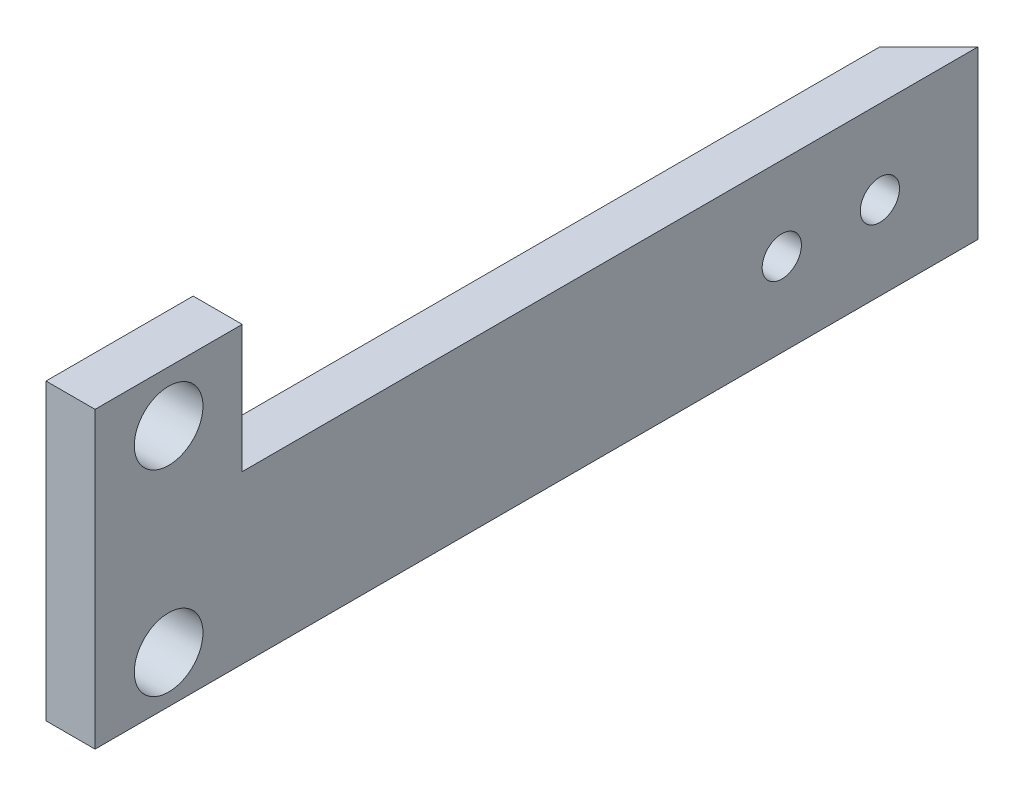
ISO-10303-21;
HEADER;
FILE_DESCRIPTION(('STEP AP214'),'2;1');
FILE_NAME('part.step','',(''),(''),'','','');
FILE_SCHEMA(('AUTOMOTIVE_DESIGN { 1 0 10303 214 1 1 1 1 }'));
ENDSEC;
DATA;
#1=APPLICATION_CONTEXT('core data for automotive mechanical design processes');
#2=APPLICATION_PROTOCOL_DEFINITION('international standard','automotive_design',2000,#1);
#3=PRODUCT_CONTEXT('',#1,'mechanical');
#4=PRODUCT('Part','Part','',(#3));
#5=PRODUCT_RELATED_PRODUCT_CATEGORY('part','',(#4));
#6=PRODUCT_DEFINITION_FORMATION('','',#4);
#7=PRODUCT_DEFINITION_CONTEXT('part definition',#1,'design');
#8=PRODUCT_DEFINITION('design','',#6,#7);
#9=PRODUCT_DEFINITION_SHAPE('','',#8);
#10=(LENGTH_UNIT() NAMED_UNIT(*) SI_UNIT(.MILLI.,.METRE.));
#11=(NAMED_UNIT(*) PLANE_ANGLE_UNIT() SI_UNIT($,.RADIAN.));
#12=(NAMED_UNIT(*) SI_UNIT($,.STERADIAN.) SOLID_ANGLE_UNIT());
#13=UNCERTAINTY_MEASURE_WITH_UNIT(LENGTH_MEASURE(1.E-05),#10,'distance_accuracy_value','');
#14=(GEOMETRIC_REPRESENTATION_CONTEXT(3) GLOBAL_UNCERTAINTY_ASSIGNED_CONTEXT((#13)) GLOBAL_UNIT_ASSIGNED_CONTEXT((#10,
#11,#12)) REPRESENTATION_CONTEXT('',''));
#15=CARTESIAN_POINT('',(0.,0.,0.));
#16=DIRECTION('',(0.,0.,1.));
#17=DIRECTION('',(1.,0.,0.));
#18=AXIS2_PLACEMENT_3D('',#15,#16,#17);
#19=CARTESIAN_POINT('',(2.5,-15.,15.));
#20=DIRECTION('',(-1.,0.,0.));
#21=DIRECTION('',(0.,0.,1.));
#22=AXIS2_PLACEMENT_3D('',#19,#20,#21);
#23=PLANE('',#22);
#24=CARTESIAN_POINT('',(2.5,-6.5,-65.));
#25=DIRECTION('',(1.,0.,0.));
#26=DIRECTION('',(0.,0.,-1.));
#27=AXIS2_PLACEMENT_3D('',#24,#25,#26);
#28=CIRCLE('',#27,2.);
#29=CARTESIAN_POINT('',(2.5,-6.5,-67.));
#30=VERTEX_POINT('',#29);
#31=EDGE_CURVE('E143',#30,#30,#28,.T.);
#32=ORIENTED_EDGE('',*,*,#31,.F.);
#33=EDGE_LOOP('',(#32));
#34=FACE_BOUND('',#33,.T.);
#35=CARTESIAN_POINT('',(2.5,-6.5,-55.));
#36=DIRECTION('',(1.,0.,0.));
#37=DIRECTION('',(0.,0.,-1.));
#38=AXIS2_PLACEMENT_3D('',#35,#36,#37);
#39=CIRCLE('',#38,2.);
#40=CARTESIAN_POINT('',(2.5,-6.5,-57.));
#41=VERTEX_POINT('',#40);
#42=EDGE_CURVE('E148',#41,#41,#39,.T.);
#43=ORIENTED_EDGE('',*,*,#42,.F.);
#44=EDGE_LOOP('',(#43));
#45=FACE_BOUND('',#44,.T.);
#46=CARTESIAN_POINT('',(2.5,9.79507701393345,7.5));
#47=DIRECTION('',(1.,0.,0.));
#48=DIRECTION('',(0.,0.,-1.));
#49=AXIS2_PLACEMENT_3D('',#46,#47,#48);
#50=CIRCLE('',#49,3.5);
#51=CARTESIAN_POINT('',(2.5,9.79507701393345,4.));
#52=VERTEX_POINT('',#51);
#53=EDGE_CURVE('E109',#52,#52,#50,.T.);
#54=ORIENTED_EDGE('',*,*,#53,.F.);
#55=EDGE_LOOP('',(#54));
#56=FACE_BOUND('',#55,.T.);
#57=CARTESIAN_POINT('',(2.5,-10.2049229860665,7.5));
#58=DIRECTION('',(1.,0.,0.));
#59=DIRECTION('',(0.,0.,-1.));
#60=AXIS2_PLACEMENT_3D('',#57,#58,#59);
#61=CIRCLE('',#60,3.5);
#62=CARTESIAN_POINT('',(2.5,-10.2049229860665,4.));
#63=VERTEX_POINT('',#62);
#64=EDGE_CURVE('E104',#63,#63,#61,.T.);
#65=ORIENTED_EDGE('',*,*,#64,.F.);
#66=EDGE_LOOP('',(#65));
#67=FACE_BOUND('',#66,.T.);
#68=DIRECTION('',(0.,0.,-1.));
#69=VECTOR('',#68,1.);
#70=CARTESIAN_POINT('',(2.5,-15.,15.));
#71=LINE('',#70,#69);
#72=CARTESIAN_POINT('',(2.5,-15.,15.));
#73=VERTEX_POINT('',#72);
#74=CARTESIAN_POINT('',(2.5,-15.,-75.));
#75=VERTEX_POINT('',#74);
#76=EDGE_CURVE('E98',#73,#75,#71,.T.);
#77=ORIENTED_EDGE('',*,*,#76,.T.);
#78=DIRECTION('',(0.,1.,0.));
#79=VECTOR('',#78,1.);
#80=CARTESIAN_POINT('',(2.5,-28.,-75.));
#81=LINE('',#80,#79);
#82=CARTESIAN_POINT('',(2.5,2.,-75.));
#83=VERTEX_POINT('',#82);
#84=EDGE_CURVE('E88',#75,#83,#81,.T.);
#85=ORIENTED_EDGE('',*,*,#84,.T.);
#86=DIRECTION('',(0.,0.,1.));
#87=VECTOR('',#86,1.);
#88=CARTESIAN_POINT('',(2.5,2.,-80.));
#89=LINE('',#88,#87);
#90=CARTESIAN_POINT('',(2.5,2.,0.));
#91=VERTEX_POINT('',#90);
#92=EDGE_CURVE('E94',#83,#91,#89,.T.);
#93=ORIENTED_EDGE('',*,*,#92,.T.);
#94=DIRECTION('',(0.,1.,0.));
#95=VECTOR('',#94,1.);
#96=CARTESIAN_POINT('',(2.5,-15.,0.));
#97=LINE('',#96,#95);
#98=CARTESIAN_POINT('',(2.5,15.,0.));
#99=VERTEX_POINT('',#98);
#100=EDGE_CURVE('E125',#91,#99,#97,.T.);
#101=ORIENTED_EDGE('',*,*,#100,.T.);
#102=DIRECTION('',(0.,0.,-1.));
#103=VECTOR('',#102,1.);
#104=CARTESIAN_POINT('',(2.5,15.,15.));
#105=LINE('',#104,#103);
#106=CARTESIAN_POINT('',(2.5,15.,15.));
#107=VERTEX_POINT('',#106);
#108=EDGE_CURVE('E11',#107,#99,#105,.T.);
#109=ORIENTED_EDGE('',*,*,#108,.F.);
#110=DIRECTION('',(0.,1.,0.));
#111=VECTOR('',#110,1.);
#112=CARTESIAN_POINT('',(2.5,-15.,15.));
#113=LINE('',#112,#111);
#114=EDGE_CURVE('E115',#73,#107,#113,.T.);
#115=ORIENTED_EDGE('',*,*,#114,.F.);
#116=EDGE_LOOP('',(#77,#85,#93,#101,#109,#115));
#117=FACE_BOUND('',#116,.T.);
#118=ADVANCED_FACE('F33',(#34,#45,#56,#67,#117),#23,.F.);
#119=CARTESIAN_POINT('',(-2.5,15.,15.));
#120=DIRECTION('',(0.,-1.,0.));
#121=DIRECTION('',(0.,0.,-1.));
#122=AXIS2_PLACEMENT_3D('',#119,#120,#121);
#123=PLANE('',#122);
#124=DIRECTION('',(-1.,0.,0.));
#125=VECTOR('',#124,1.);
#126=CARTESIAN_POINT('',(-2.5,15.,0.));
#127=LINE('',#126,#125);
#128=CARTESIAN_POINT('',(-2.5,15.,0.));
#129=VERTEX_POINT('',#128);
#130=EDGE_CURVE('E127',#99,#129,#127,.T.);
#131=ORIENTED_EDGE('',*,*,#130,.T.);
#132=DIRECTION('',(0.,0.,-1.));
#133=VECTOR('',#132,1.);
#134=CARTESIAN_POINT('',(-2.5,15.,15.));
#135=LINE('',#134,#133);
#136=CARTESIAN_POINT('',(-2.5,15.,15.));
#137=VERTEX_POINT('',#136);
#138=EDGE_CURVE('E41',#137,#129,#135,.T.);
#139=ORIENTED_EDGE('',*,*,#138,.F.);
#140=DIRECTION('',(-1.,0.,0.));
#141=VECTOR('',#140,1.);
#142=CARTESIAN_POINT('',(-2.5,15.,15.));
#143=LINE('',#142,#141);
#144=EDGE_CURVE('E118',#107,#137,#143,.T.);
#145=ORIENTED_EDGE('',*,*,#144,.F.);
#146=ORIENTED_EDGE('',*,*,#108,.T.);
#147=EDGE_LOOP('',(#131,#139,#145,#146));
#148=FACE_BOUND('',#147,.T.);
#149=ADVANCED_FACE('F169',(#148),#123,.F.);
#150=CARTESIAN_POINT('',(-2.5,-15.,15.));
#151=DIRECTION('',(1.,0.,0.));
#152=DIRECTION('',(0.,0.,-1.));
#153=AXIS2_PLACEMENT_3D('',#150,#151,#152);
#154=PLANE('',#153);
#155=CARTESIAN_POINT('',(-2.5,-6.5,-65.));
#156=DIRECTION('',(1.,0.,0.));
#157=DIRECTION('',(0.,0.,-1.));
#158=AXIS2_PLACEMENT_3D('',#155,#156,#157);
#159=CIRCLE('',#158,2.);
#160=CARTESIAN_POINT('',(-2.5,-6.5,-67.));
#161=VERTEX_POINT('',#160);
#162=EDGE_CURVE('E36',#161,#161,#159,.T.);
#163=ORIENTED_EDGE('',*,*,#162,.T.);
#164=EDGE_LOOP('',(#163));
#165=FACE_BOUND('',#164,.T.);
#166=CARTESIAN_POINT('',(-2.5,-6.5,-55.));
#167=DIRECTION('',(1.,0.,0.));
#168=DIRECTION('',(0.,0.,-1.));
#169=AXIS2_PLACEMENT_3D('',#166,#167,#168);
#170=CIRCLE('',#169,2.);
#171=CARTESIAN_POINT('',(-2.5,-6.5,-57.));
#172=VERTEX_POINT('',#171);
#173=EDGE_CURVE('E141',#172,#172,#170,.T.);
#174=ORIENTED_EDGE('',*,*,#173,.T.);
#175=EDGE_LOOP('',(#174));
#176=FACE_BOUND('',#175,.T.);
#177=CARTESIAN_POINT('',(-2.5,9.79507701393345,7.5));
#178=DIRECTION('',(1.,0.,0.));
#179=DIRECTION('',(0.,0.,-1.));
#180=AXIS2_PLACEMENT_3D('',#177,#178,#179);
#181=CIRCLE('',#180,3.5);
#182=CARTESIAN_POINT('',(-2.5,9.79507701393345,4.));
#183=VERTEX_POINT('',#182);
#184=EDGE_CURVE('E128',#183,#183,#181,.T.);
#185=ORIENTED_EDGE('',*,*,#184,.T.);
#186=EDGE_LOOP('',(#185));
#187=FACE_BOUND('',#186,.T.);
#188=CARTESIAN_POINT('',(-2.5,-10.2049229860665,7.5));
#189=DIRECTION('',(1.,0.,0.));
#190=DIRECTION('',(0.,0.,-1.));
#191=AXIS2_PLACEMENT_3D('',#188,#189,#190);
#192=CIRCLE('',#191,3.5);
#193=CARTESIAN_POINT('',(-2.5,-10.2049229860665,4.));
#194=VERTEX_POINT('',#193);
#195=EDGE_CURVE('E112',#194,#194,#192,.T.);
#196=ORIENTED_EDGE('',*,*,#195,.T.);
#197=EDGE_LOOP('',(#196));
#198=FACE_BOUND('',#197,.T.);
#199=DIRECTION('',(0.,0.,1.));
#200=VECTOR('',#199,1.);
#201=CARTESIAN_POINT('',(-2.5,2.,-80.));
#202=LINE('',#201,#200);
#203=CARTESIAN_POINT('',(-2.5,2.,-70.));
#204=VERTEX_POINT('',#203);
#205=CARTESIAN_POINT('',(-2.5,2.,0.));
#206=VERTEX_POINT('',#205);
#207=EDGE_CURVE('E56',#204,#206,#202,.T.);
#208=ORIENTED_EDGE('',*,*,#207,.F.);
#209=DIRECTION('',(0.,1.,0.));
#210=VECTOR('',#209,1.);
#211=CARTESIAN_POINT('',(-2.5,-28.,-70.));
#212=LINE('',#211,#210);
#213=CARTESIAN_POINT('',(-2.5,-15.,-70.));
#214=VERTEX_POINT('',#213);
#215=EDGE_CURVE('E49',#214,#204,#212,.T.);
#216=ORIENTED_EDGE('',*,*,#215,.F.);
#217=DIRECTION('',(0.,0.,-1.));
#218=VECTOR('',#217,1.);
#219=CARTESIAN_POINT('',(-2.5,-15.,15.));
#220=LINE('',#219,#218);
#221=CARTESIAN_POINT('',(-2.5,-15.,15.));
#222=VERTEX_POINT('',#221);
#223=EDGE_CURVE('E133',#222,#214,#220,.T.);
#224=ORIENTED_EDGE('',*,*,#223,.F.);
#225=DIRECTION('',(0.,-1.,0.));
#226=VECTOR('',#225,1.);
#227=CARTESIAN_POINT('',(-2.5,-15.,15.));
#228=LINE('',#227,#226);
#229=EDGE_CURVE('E121',#137,#222,#228,.T.);
#230=ORIENTED_EDGE('',*,*,#229,.F.);
#231=ORIENTED_EDGE('',*,*,#138,.T.);
#232=DIRECTION('',(0.,-1.,0.));
#233=VECTOR('',#232,1.);
#234=CARTESIAN_POINT('',(-2.5,-15.,0.));
#235=LINE('',#234,#233);
#236=EDGE_CURVE('E119',#129,#206,#235,.T.);
#237=ORIENTED_EDGE('',*,*,#236,.T.);
#238=EDGE_LOOP('',(#208,#216,#224,#230,#231,#237));
#239=FACE_BOUND('',#238,.T.);
#240=ADVANCED_FACE('F160',(#165,#176,#187,#198,#239),#154,.F.);
#241=CARTESIAN_POINT('',(-2.5,-15.,15.));
#242=DIRECTION('',(0.,1.,0.));
#243=DIRECTION('',(0.,0.,1.));
#244=AXIS2_PLACEMENT_3D('',#241,#242,#243);
#245=PLANE('',#244);
#246=ORIENTED_EDGE('',*,*,#223,.T.);
#247=DIRECTION('',(0.707106781186547,0.,-0.707106781186548));
#248=VECTOR('',#247,1.);
#249=CARTESIAN_POINT('',(-45.,-15.,-27.4999999999999));
#250=LINE('',#249,#248);
#251=EDGE_CURVE('E99',#214,#75,#250,.T.);
#252=ORIENTED_EDGE('',*,*,#251,.T.);
#253=ORIENTED_EDGE('',*,*,#76,.F.);
#254=DIRECTION('',(1.,0.,0.));
#255=VECTOR('',#254,1.);
#256=CARTESIAN_POINT('',(-2.5,-15.,15.));
#257=LINE('',#256,#255);
#258=EDGE_CURVE('E123',#222,#73,#257,.T.);
#259=ORIENTED_EDGE('',*,*,#258,.F.);
#260=EDGE_LOOP('',(#246,#252,#253,#259));
#261=FACE_BOUND('',#260,.T.);
#262=ADVANCED_FACE('F156',(#261),#245,.F.);
#263=CARTESIAN_POINT('',(0.,0.,15.));
#264=DIRECTION('',(0.,0.,-1.));
#265=DIRECTION('',(-1.,0.,0.));
#266=AXIS2_PLACEMENT_3D('',#263,#264,#265);
#267=PLANE('',#266);
#268=ORIENTED_EDGE('',*,*,#114,.T.);
#269=ORIENTED_EDGE('',*,*,#144,.T.);
#270=ORIENTED_EDGE('',*,*,#229,.T.);
#271=ORIENTED_EDGE('',*,*,#258,.T.);
#272=EDGE_LOOP('',(#268,#269,#270,#271));
#273=FACE_BOUND('',#272,.T.);
#274=ADVANCED_FACE('F171',(#273),#267,.F.);
#275=CARTESIAN_POINT('',(0.,0.,0.));
#276=DIRECTION('',(0.,0.,-1.));
#277=DIRECTION('',(-1.,0.,0.));
#278=AXIS2_PLACEMENT_3D('',#275,#276,#277);
#279=PLANE('',#278);
#280=DIRECTION('',(1.,0.,0.));
#281=VECTOR('',#280,1.);
#282=CARTESIAN_POINT('',(2.5,2.,0.));
#283=LINE('',#282,#281);
#284=EDGE_CURVE('E102',#206,#91,#283,.T.);
#285=ORIENTED_EDGE('',*,*,#284,.F.);
#286=ORIENTED_EDGE('',*,*,#236,.F.);
#287=ORIENTED_EDGE('',*,*,#130,.F.);
#288=ORIENTED_EDGE('',*,*,#100,.F.);
#289=EDGE_LOOP('',(#285,#286,#287,#288));
#290=FACE_BOUND('',#289,.T.);
#291=ADVANCED_FACE('F166',(#290),#279,.T.);
#292=CARTESIAN_POINT('',(-12.5,-10.2049229860665,7.5));
#293=DIRECTION('',(1.,0.,0.));
#294=DIRECTION('',(0.,0.,-1.));
#295=AXIS2_PLACEMENT_3D('',#292,#293,#294);
#296=CYLINDRICAL_SURFACE('',#295,3.5);
#297=ORIENTED_EDGE('',*,*,#64,.T.);
#298=EDGE_LOOP('',(#297));
#299=FACE_BOUND('',#298,.T.);
#300=ORIENTED_EDGE('',*,*,#195,.F.);
#301=EDGE_LOOP('',(#300));
#302=FACE_BOUND('',#301,.T.);
#303=ADVANCED_FACE('F178',(#299,#302),#296,.F.);
#304=CARTESIAN_POINT('',(-12.5,9.79507701393345,7.5));
#305=DIRECTION('',(1.,0.,0.));
#306=DIRECTION('',(0.,0.,-1.));
#307=AXIS2_PLACEMENT_3D('',#304,#305,#306);
#308=CYLINDRICAL_SURFACE('',#307,3.5);
#309=ORIENTED_EDGE('',*,*,#53,.T.);
#310=EDGE_LOOP('',(#309));
#311=FACE_BOUND('',#310,.T.);
#312=ORIENTED_EDGE('',*,*,#184,.F.);
#313=EDGE_LOOP('',(#312));
#314=FACE_BOUND('',#313,.T.);
#315=ADVANCED_FACE('F196',(#311,#314),#308,.F.);
#316=CARTESIAN_POINT('',(2.5,2.,-80.));
#317=DIRECTION('',(0.,-1.,0.));
#318=DIRECTION('',(0.,0.,-1.));
#319=AXIS2_PLACEMENT_3D('',#316,#317,#318);
#320=PLANE('',#319);
#321=ORIENTED_EDGE('',*,*,#92,.F.);
#322=DIRECTION('',(0.707106781186547,0.,-0.707106781186548));
#323=VECTOR('',#322,1.);
#324=CARTESIAN_POINT('',(-36.25,2.,-36.25));
#325=LINE('',#324,#323);
#326=EDGE_CURVE('E85',#204,#83,#325,.T.);
#327=ORIENTED_EDGE('',*,*,#326,.F.);
#328=ORIENTED_EDGE('',*,*,#207,.T.);
#329=ORIENTED_EDGE('',*,*,#284,.T.);
#330=EDGE_LOOP('',(#321,#327,#328,#329));
#331=FACE_BOUND('',#330,.T.);
#332=ADVANCED_FACE('F101',(#331),#320,.F.);
#333=CARTESIAN_POINT('',(-72.5,-6.5,-55.));
#334=DIRECTION('',(1.,0.,0.));
#335=DIRECTION('',(0.,0.,-1.));
#336=AXIS2_PLACEMENT_3D('',#333,#334,#335);
#337=CYLINDRICAL_SURFACE('',#336,2.);
#338=ORIENTED_EDGE('',*,*,#42,.T.);
#339=EDGE_LOOP('',(#338));
#340=FACE_BOUND('',#339,.T.);
#341=ORIENTED_EDGE('',*,*,#173,.F.);
#342=EDGE_LOOP('',(#341));
#343=FACE_BOUND('',#342,.T.);
#344=ADVANCED_FACE('F214',(#340,#343),#337,.F.);
#345=CARTESIAN_POINT('',(-72.5,-6.5,-65.));
#346=DIRECTION('',(1.,0.,0.));
#347=DIRECTION('',(0.,0.,-1.));
#348=AXIS2_PLACEMENT_3D('',#345,#346,#347);
#349=CYLINDRICAL_SURFACE('',#348,2.);
#350=ORIENTED_EDGE('',*,*,#31,.T.);
#351=EDGE_LOOP('',(#350));
#352=FACE_BOUND('',#351,.T.);
#353=ORIENTED_EDGE('',*,*,#162,.F.);
#354=EDGE_LOOP('',(#353));
#355=FACE_BOUND('',#354,.T.);
#356=ADVANCED_FACE('F219',(#352,#355),#349,.F.);
#357=CARTESIAN_POINT('',(-36.25,-28.,-36.25));
#358=DIRECTION('',(0.707106781186548,0.,0.707106781186547));
#359=DIRECTION('',(0.707106781186547,0.,-0.707106781186548));
#360=AXIS2_PLACEMENT_3D('',#357,#358,#359);
#361=PLANE('',#360);
#362=ORIENTED_EDGE('',*,*,#215,.T.);
#363=ORIENTED_EDGE('',*,*,#326,.T.);
#364=ORIENTED_EDGE('',*,*,#84,.F.);
#365=ORIENTED_EDGE('',*,*,#251,.F.);
#366=EDGE_LOOP('',(#362,#363,#364,#365));
#367=FACE_BOUND('',#366,.T.);
#368=ADVANCED_FACE('F87',(#367),#361,.F.);
#369=CLOSED_SHELL('',(#118,#149,#240,#262,#274,#291,#303,#315,#332,#344,#356,#368));
#370=MANIFOLD_SOLID_BREP('B2',#369);
#371=ADVANCED_BREP_SHAPE_REPRESENTATION('',(#18,#370),#14);
#372=SHAPE_DEFINITION_REPRESENTATION(#9,#371);
ENDSEC;
END-ISO-10303-21;
